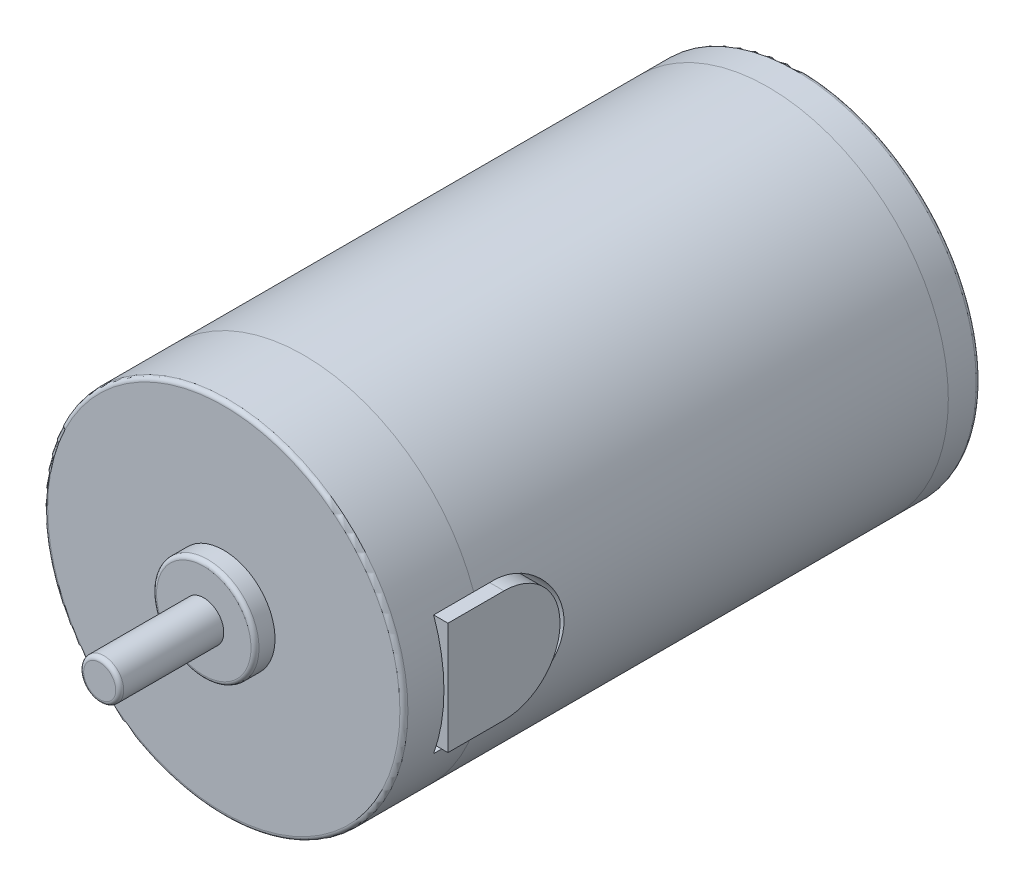
ISO-10303-21;
HEADER;
FILE_DESCRIPTION(('STEP AP214'),'2;1');
FILE_NAME('part.step','',(''),(''),'','','');
FILE_SCHEMA(('AUTOMOTIVE_DESIGN { 1 0 10303 214 1 1 1 1 }'));
ENDSEC;
DATA;
#1=APPLICATION_CONTEXT('core data for automotive mechanical design processes');
#2=APPLICATION_PROTOCOL_DEFINITION('international standard','automotive_design',2000,#1);
#3=PRODUCT_CONTEXT('',#1,'mechanical');
#4=PRODUCT('Part','Part','',(#3));
#5=PRODUCT_RELATED_PRODUCT_CATEGORY('part','',(#4));
#6=PRODUCT_DEFINITION_FORMATION('','',#4);
#7=PRODUCT_DEFINITION_CONTEXT('part definition',#1,'design');
#8=PRODUCT_DEFINITION('design','',#6,#7);
#9=PRODUCT_DEFINITION_SHAPE('','',#8);
#10=(LENGTH_UNIT() NAMED_UNIT(*) SI_UNIT(.MILLI.,.METRE.));
#11=(NAMED_UNIT(*) PLANE_ANGLE_UNIT() SI_UNIT($,.RADIAN.));
#12=(NAMED_UNIT(*) SI_UNIT($,.STERADIAN.) SOLID_ANGLE_UNIT());
#13=UNCERTAINTY_MEASURE_WITH_UNIT(LENGTH_MEASURE(1.E-05),#10,'distance_accuracy_value','');
#14=(GEOMETRIC_REPRESENTATION_CONTEXT(3) GLOBAL_UNCERTAINTY_ASSIGNED_CONTEXT((#13)) GLOBAL_UNIT_ASSIGNED_CONTEXT((#10,
#11,#12)) REPRESENTATION_CONTEXT('',''));
#15=CARTESIAN_POINT('',(0.,0.,0.));
#16=DIRECTION('',(0.,0.,1.));
#17=DIRECTION('',(1.,0.,0.));
#18=AXIS2_PLACEMENT_3D('',#15,#16,#17);
#19=CARTESIAN_POINT('',(0.,0.,0.));
#20=DIRECTION('',(0.,0.,-1.));
#21=DIRECTION('',(-1.,0.,0.));
#22=AXIS2_PLACEMENT_3D('',#19,#20,#21);
#23=CYLINDRICAL_SURFACE('',#22,22.5);
#24=CARTESIAN_POINT('',(0.,0.,4.));
#25=DIRECTION('',(0.,0.,-1.));
#26=DIRECTION('',(0.,1.,0.));
#27=AXIS2_PLACEMENT_3D('',#24,#25,#26);
#28=CIRCLE('',#27,22.5);
#29=CARTESIAN_POINT('',(0.,-22.5,4.));
#30=VERTEX_POINT('',#29);
#31=CARTESIAN_POINT('',(0.,22.5,4.));
#32=VERTEX_POINT('',#31);
#33=EDGE_CURVE('E321',#30,#32,#28,.F.);
#34=ORIENTED_EDGE('',*,*,#33,.T.);
#35=EDGE_CURVE('E325',#32,#30,#28,.F.);
#36=ORIENTED_EDGE('',*,*,#35,.T.);
#37=EDGE_LOOP('',(#34,#36));
#38=FACE_BOUND('',#37,.T.);
#39=CARTESIAN_POINT('',(0.,0.,62.));
#40=DIRECTION('',(0.,0.,-1.));
#41=DIRECTION('',(0.,1.,0.));
#42=AXIS2_PLACEMENT_3D('',#39,#40,#41);
#43=CIRCLE('',#42,22.5);
#44=CARTESIAN_POINT('',(-21.2132034355964,-7.49999999999998,62.));
#45=VERTEX_POINT('',#44);
#46=CARTESIAN_POINT('',(0.,-22.5,62.));
#47=VERTEX_POINT('',#46);
#48=EDGE_CURVE('E319',#45,#47,#43,.F.);
#49=ORIENTED_EDGE('',*,*,#48,.F.);
#50=DIRECTION('',(0.,0.,-1.));
#51=VECTOR('',#50,1.);
#52=CARTESIAN_POINT('',(-21.2132034355964,-7.49999999999998,0.));
#53=LINE('',#52,#51);
#54=CARTESIAN_POINT('',(-21.2132034355964,-7.49999999999999,59.5));
#55=VERTEX_POINT('',#54);
#56=EDGE_CURVE('E237',#45,#55,#53,.T.);
#57=ORIENTED_EDGE('',*,*,#56,.T.);
#58=CARTESIAN_POINT('',(-21.2132034355964,-7.5,59.5));
#59=CARTESIAN_POINT('',(-21.2131698601994,-7.50002909434924,59.29538248346));
#60=CARTESIAN_POINT('',(-21.2161628473145,-7.49162767701928,59.0907776341581));
#61=CARTESIAN_POINT('',(-21.2279561906622,-7.4581803133176,58.6831550271935));
#62=CARTESIAN_POINT('',(-21.2367549792327,-7.43313886001647,58.4801368560705));
#63=CARTESIAN_POINT('',(-21.2598802246242,-7.36672589632513,58.0777322389389));
#64=CARTESIAN_POINT('',(-21.2741902834876,-7.32540282113041,57.8783368396676));
#65=CARTESIAN_POINT('',(-21.3078818593139,-7.22681804240021,57.4839622464634));
#66=CARTESIAN_POINT('',(-21.3272635595626,-7.16955576282734,57.2889832124118));
#67=CARTESIAN_POINT('',(-21.3704954114402,-7.03964473805045,56.904914297494));
#68=CARTESIAN_POINT('',(-21.394341953067,-6.96700841722466,56.7158198017907));
#69=CARTESIAN_POINT('',(-21.4458257189055,-6.8068811511058,56.3444860843478));
#70=CARTESIAN_POINT('',(-21.4734643521334,-6.71938468138361,56.1622494429843));
#71=CARTESIAN_POINT('',(-21.5317541800848,-6.53018810396585,55.8057649904732));
#72=CARTESIAN_POINT('',(-21.5624059975797,-6.42848505818823,55.6315188417774));
#73=CARTESIAN_POINT('',(-21.625897359703,-6.21154868862573,55.2920000626968));
#74=CARTESIAN_POINT('',(-21.6587376890376,-6.09631050030497,55.1267306899701));
#75=CARTESIAN_POINT('',(-21.7269132825655,-5.84878510718893,54.8005221603799));
#76=CARTESIAN_POINT('',(-21.7622956681428,-5.71604103814825,54.6399393523954));
#77=CARTESIAN_POINT('',(-21.8335037312281,-5.43771504368631,54.3304183176399));
#78=CARTESIAN_POINT('',(-21.8693294173298,-5.2921328690541,54.1814803170215));
#79=CARTESIAN_POINT('',(-21.9404749011191,-4.98896851579837,53.8961136145323));
#80=CARTESIAN_POINT('',(-21.975794516795,-4.83138214241325,53.7596893225126));
#81=CARTESIAN_POINT('',(-22.0449629867248,-4.50526119571736,53.5003323477956));
#82=CARTESIAN_POINT('',(-22.0788123492642,-4.33673045710713,53.3773949797037));
#83=CARTESIAN_POINT('',(-22.1450219906145,-3.98507810927253,53.1427198975304));
#84=CARTESIAN_POINT('',(-22.1773188594365,-3.80168788560119,53.0313662703396));
#85=CARTESIAN_POINT('',(-22.2385041201037,-3.4256677207239,52.8246110977922));
#86=CARTESIAN_POINT('',(-22.2673937702417,-3.23304122769018,52.7292036580115));
#87=CARTESIAN_POINT('',(-22.3209497800935,-2.8398180259788,52.5550980189717));
#88=CARTESIAN_POINT('',(-22.345616343282,-2.63922170187355,52.4763990146312));
#89=CARTESIAN_POINT('',(-22.3900068806189,-2.23150871257408,52.3364241967951));
#90=CARTESIAN_POINT('',(-22.4097310667763,-2.02439232749468,52.275147635928));
#91=CARTESIAN_POINT('',(-22.4430614974481,-1.61250916225514,52.1724297537449));
#92=CARTESIAN_POINT('',(-22.4568566273779,-1.40791110618133,52.1303728081682));
#93=CARTESIAN_POINT('',(-22.4789084924431,-0.995630675690124,52.0634464924363));
#94=CARTESIAN_POINT('',(-22.4871654486779,-0.787948424740835,52.0385764361311));
#95=CARTESIAN_POINT('',(-22.4979048793719,-0.371123439773067,52.006272196708));
#96=CARTESIAN_POINT('',(-22.5003884669374,-0.161980995080541,51.9988346525968));
#97=CARTESIAN_POINT('',(-22.4995129405441,0.25617928126824,52.0014611275526));
#98=CARTESIAN_POINT('',(-22.4961539618238,0.465197115696834,52.0115247415187));
#99=CARTESIAN_POINT('',(-22.4839369452838,0.873267929481121,52.048308628608));
#100=CARTESIAN_POINT('',(-22.4753011245303,1.07238866895073,52.0743559782884));
#101=CARTESIAN_POINT('',(-22.4529527569557,1.46769069299626,52.1422750944698));
#102=CARTESIAN_POINT('',(-22.4392385246955,1.6638709791693,52.1841521146673));
#103=CARTESIAN_POINT('',(-22.4070952461079,2.05181836927761,52.2833445679225));
#104=CARTESIAN_POINT('',(-22.3886677783507,2.24358692740878,52.3406548323728));
#105=CARTESIAN_POINT('',(-22.3475590775842,2.62159618356247,52.4702650951266));
#106=CARTESIAN_POINT('',(-22.3248762396294,2.80783476511464,52.5425707501452));
#107=CARTESIAN_POINT('',(-22.2755174963821,3.17588349487949,52.7026074666674));
#108=CARTESIAN_POINT('',(-22.2487943058965,3.35760674122855,52.7905236904));
#109=CARTESIAN_POINT('',(-22.1922404744283,3.71306703589137,52.9805091411496));
#110=CARTESIAN_POINT('',(-22.1624087708866,3.88680132395984,53.0825832116082));
#111=CARTESIAN_POINT('',(-22.1003884743408,4.2252132263548,53.300157976111));
#112=CARTESIAN_POINT('',(-22.0681997635114,4.38989038720014,53.4156593415464));
#113=CARTESIAN_POINT('',(-22.0022623174511,4.70925088946099,53.6593405315096));
#114=CARTESIAN_POINT('',(-21.9685135255208,4.86393386715911,53.7875208170311));
#115=CARTESIAN_POINT('',(-21.8986777674863,5.16948929944189,54.0621200369785));
#116=CARTESIAN_POINT('',(-21.8625556340792,5.31983712317657,54.2091143255371));
#117=CARTESIAN_POINT('',(-21.7905108194672,5.60764150651647,54.5151759276488));
#118=CARTESIAN_POINT('',(-21.7545880793291,5.74510208950156,54.6742394449559));
#119=CARTESIAN_POINT('',(-21.6839003385951,6.00639670772375,55.0036215281012));
#120=CARTESIAN_POINT('',(-21.6491361601132,6.13022120458748,55.1739478405849));
#121=CARTESIAN_POINT('',(-21.5817947177549,6.36324170341309,55.52464356969));
#122=CARTESIAN_POINT('',(-21.5492166036067,6.47244340957115,55.7050090310474));
#123=CARTESIAN_POINT('',(-21.4867173229691,6.6770202259949,56.0775387637503));
#124=CARTESIAN_POINT('',(-21.4568442463993,6.77215910785624,56.2698410121142));
#125=CARTESIAN_POINT('',(-21.4012780111611,6.94576189207952,56.6623221864171));
#126=CARTESIAN_POINT('',(-21.3755831137459,7.02423273502181,56.8624977925709));
#127=CARTESIAN_POINT('',(-21.3292271317958,7.16376155149272,57.2691535973905));
#128=CARTESIAN_POINT('',(-21.3085605743674,7.22483846919712,57.4756266637858));
#129=CARTESIAN_POINT('',(-21.2729338580985,7.32907275497639,57.8934412124492));
#130=CARTESIAN_POINT('',(-21.2579710938087,7.37223830562734,58.1047804250033));
#131=CARTESIAN_POINT('',(-21.2352550417274,7.4374116223722,58.5130793544809));
#132=CARTESIAN_POINT('',(-21.2270072647544,7.4608756924865,58.7097802328843));
#133=CARTESIAN_POINT('',(-21.2159705894885,7.49217187160105,59.1043157399874));
#134=CARTESIAN_POINT('',(-21.2131746472626,7.50002415175723,59.3021485740774));
#135=CARTESIAN_POINT('',(-21.2132034355964,7.49999999999998,59.5));
#136=B_SPLINE_CURVE_WITH_KNOTS('',3,(#58,#59,#60,#61,#62,#63,#64,#65,#66,#67,#68,#69,#70,#71,
#72,#73,#74,#75,#76,#77,#78,#79,#80,#81,#82,#83,#84,#85,#86,#87,#88,#89,#90,#91,#92,#93,#94,#95,
#96,#97,#98,#99,#100,#101,#102,#103,#104,#105,#106,#107,#108,#109,#110,#111,#112,#113,#114,#115,
#116,#117,#118,#119,#120,#121,#122,#123,#124,#125,#126,#127,#128,#129,#130,#131,#132,#133,#134,
#135),.UNSPECIFIED.,.F.,.F.,(4,2,2,2,2,2,2,2,2,2,2,2,2,2,2,2,2,2,2,2,2,2,2,2,2,2,2,2,2,2,2,2,2,
2,2,2,2,2,4),(0.,0.613638635534736,1.22711164630862,1.83877328832488,2.45045703845383,
3.06164833708557,3.67306735238838,4.28461300384992,4.89637912151772,5.52964681441623,
6.16292680289795,6.79642910970495,7.42971063444706,8.07980854205101,8.72966561037011,
9.37949135879165,10.0292892274014,10.6564922281588,11.2836701877234,11.9107272172464,
12.5377697324087,13.140069807341,13.7425699549161,14.3448685750436,14.9473948150588,
15.5576140230805,16.1680425061825,16.7785015250461,17.3889827477895,18.0282841622701,
18.6673853183619,19.3069307203285,19.9462259110633,20.5952694813644,21.2440422574535,
21.8921057121206,22.5398727805735,23.1339873690169,23.7273338337398),.UNSPECIFIED.);
#137=CARTESIAN_POINT('',(-21.2132034355964,7.49999999999998,59.5));
#138=VERTEX_POINT('',#137);
#139=EDGE_CURVE('E11',#55,#138,#136,.T.);
#140=ORIENTED_EDGE('',*,*,#139,.T.);
#141=DIRECTION('',(0.,0.,-1.));
#142=VECTOR('',#141,1.);
#143=CARTESIAN_POINT('',(-21.2132034355964,7.49999999999998,0.));
#144=LINE('',#143,#142);
#145=CARTESIAN_POINT('',(-21.2132034355964,7.49999999999998,62.));
#146=VERTEX_POINT('',#145);
#147=EDGE_CURVE('E248',#138,#146,#144,.F.);
#148=ORIENTED_EDGE('',*,*,#147,.T.);
#149=CARTESIAN_POINT('',(0.,22.5,62.));
#150=VERTEX_POINT('',#149);
#151=EDGE_CURVE('E320',#150,#146,#43,.F.);
#152=ORIENTED_EDGE('',*,*,#151,.F.);
#153=CARTESIAN_POINT('',(21.2132034355964,7.49999999999998,62.));
#154=VERTEX_POINT('',#153);
#155=EDGE_CURVE('E314',#154,#150,#43,.F.);
#156=ORIENTED_EDGE('',*,*,#155,.F.);
#157=DIRECTION('',(0.,0.,-1.));
#158=VECTOR('',#157,1.);
#159=CARTESIAN_POINT('',(21.2132034355964,7.49999999999998,0.));
#160=LINE('',#159,#158);
#161=CARTESIAN_POINT('',(21.2132034355964,7.49999999999998,59.5));
#162=VERTEX_POINT('',#161);
#163=EDGE_CURVE('E306',#162,#154,#160,.F.);
#164=ORIENTED_EDGE('',*,*,#163,.F.);
#165=CARTESIAN_POINT('',(21.2132034355964,-7.5,59.5));
#166=CARTESIAN_POINT('',(21.2131698601994,-7.50002909434924,59.29538248346));
#167=CARTESIAN_POINT('',(21.2161628473145,-7.49162767701928,59.0907776341581));
#168=CARTESIAN_POINT('',(21.2279561906622,-7.4581803133176,58.6831550271935));
#169=CARTESIAN_POINT('',(21.2367549792327,-7.43313886001647,58.4801368560705));
#170=CARTESIAN_POINT('',(21.2598802246242,-7.36672589632513,58.0777322389389));
#171=CARTESIAN_POINT('',(21.2741902834876,-7.32540282113041,57.8783368396676));
#172=CARTESIAN_POINT('',(21.3078818593139,-7.22681804240021,57.4839622464634));
#173=CARTESIAN_POINT('',(21.3272635595626,-7.16955576282734,57.2889832124118));
#174=CARTESIAN_POINT('',(21.3704954114402,-7.03964473805045,56.904914297494));
#175=CARTESIAN_POINT('',(21.394341953067,-6.96700841722466,56.7158198017907));
#176=CARTESIAN_POINT('',(21.4458257189055,-6.8068811511058,56.3444860843478));
#177=CARTESIAN_POINT('',(21.4734643521334,-6.71938468138361,56.1622494429843));
#178=CARTESIAN_POINT('',(21.5317541800848,-6.53018810396585,55.8057649904732));
#179=CARTESIAN_POINT('',(21.5624059975797,-6.42848505818823,55.6315188417774));
#180=CARTESIAN_POINT('',(21.625897359703,-6.21154868862573,55.2920000626968));
#181=CARTESIAN_POINT('',(21.6587376890376,-6.09631050030497,55.1267306899701));
#182=CARTESIAN_POINT('',(21.7269132825655,-5.84878510718893,54.8005221603799));
#183=CARTESIAN_POINT('',(21.7622956681428,-5.71604103814825,54.6399393523954));
#184=CARTESIAN_POINT('',(21.8335037312281,-5.43771504368631,54.3304183176399));
#185=CARTESIAN_POINT('',(21.8693294173298,-5.2921328690541,54.1814803170215));
#186=CARTESIAN_POINT('',(21.9404749011191,-4.98896851579837,53.8961136145323));
#187=CARTESIAN_POINT('',(21.975794516795,-4.83138214241325,53.7596893225126));
#188=CARTESIAN_POINT('',(22.0449629867248,-4.50526119571736,53.5003323477956));
#189=CARTESIAN_POINT('',(22.0788123492642,-4.33673045710713,53.3773949797037));
#190=CARTESIAN_POINT('',(22.1450219906145,-3.98507810927253,53.1427198975304));
#191=CARTESIAN_POINT('',(22.1773188594365,-3.80168788560119,53.0313662703396));
#192=CARTESIAN_POINT('',(22.2385041201037,-3.4256677207239,52.8246110977922));
#193=CARTESIAN_POINT('',(22.2673937702417,-3.23304122769018,52.7292036580115));
#194=CARTESIAN_POINT('',(22.3209497800935,-2.8398180259788,52.5550980189717));
#195=CARTESIAN_POINT('',(22.345616343282,-2.63922170187355,52.4763990146312));
#196=CARTESIAN_POINT('',(22.3900068806189,-2.23150871257408,52.3364241967951));
#197=CARTESIAN_POINT('',(22.4097310667763,-2.02439232749468,52.275147635928));
#198=CARTESIAN_POINT('',(22.4430614974481,-1.61250916225514,52.1724297537449));
#199=CARTESIAN_POINT('',(22.4568566273779,-1.40791110618133,52.1303728081682));
#200=CARTESIAN_POINT('',(22.4789084924431,-0.995630675690124,52.0634464924363));
#201=CARTESIAN_POINT('',(22.4871654486779,-0.787948424740835,52.0385764361311));
#202=CARTESIAN_POINT('',(22.4979048793719,-0.371123439773067,52.006272196708));
#203=CARTESIAN_POINT('',(22.5003884669374,-0.161980995080541,51.9988346525968));
#204=CARTESIAN_POINT('',(22.4995129405441,0.25617928126824,52.0014611275526));
#205=CARTESIAN_POINT('',(22.4961539618238,0.465197115696834,52.0115247415187));
#206=CARTESIAN_POINT('',(22.4839369452838,0.873267929481121,52.048308628608));
#207=CARTESIAN_POINT('',(22.4753011245303,1.07238866895073,52.0743559782884));
#208=CARTESIAN_POINT('',(22.4529527569557,1.46769069299626,52.1422750944698));
#209=CARTESIAN_POINT('',(22.4392385246955,1.6638709791693,52.1841521146673));
#210=CARTESIAN_POINT('',(22.4070952461079,2.05181836927761,52.2833445679225));
#211=CARTESIAN_POINT('',(22.3886677783507,2.24358692740878,52.3406548323728));
#212=CARTESIAN_POINT('',(22.3475590775842,2.62159618356247,52.4702650951266));
#213=CARTESIAN_POINT('',(22.3248762396294,2.80783476511464,52.5425707501452));
#214=CARTESIAN_POINT('',(22.2755174963821,3.17588349487949,52.7026074666674));
#215=CARTESIAN_POINT('',(22.2487943058965,3.35760674122855,52.7905236904));
#216=CARTESIAN_POINT('',(22.1922404744283,3.71306703589137,52.9805091411496));
#217=CARTESIAN_POINT('',(22.1624087708866,3.88680132395984,53.0825832116082));
#218=CARTESIAN_POINT('',(22.1003884743408,4.2252132263548,53.300157976111));
#219=CARTESIAN_POINT('',(22.0681997635114,4.38989038720014,53.4156593415464));
#220=CARTESIAN_POINT('',(22.0022623174511,4.70925088946099,53.6593405315096));
#221=CARTESIAN_POINT('',(21.9685135255208,4.86393386715911,53.7875208170311));
#222=CARTESIAN_POINT('',(21.8986777674863,5.16948929944189,54.0621200369785));
#223=CARTESIAN_POINT('',(21.8625556340792,5.31983712317657,54.2091143255371));
#224=CARTESIAN_POINT('',(21.7905108194672,5.60764150651647,54.5151759276488));
#225=CARTESIAN_POINT('',(21.7545880793291,5.74510208950156,54.6742394449559));
#226=CARTESIAN_POINT('',(21.6839003385951,6.00639670772375,55.0036215281012));
#227=CARTESIAN_POINT('',(21.6491361601132,6.13022120458748,55.1739478405849));
#228=CARTESIAN_POINT('',(21.5817947177549,6.36324170341309,55.52464356969));
#229=CARTESIAN_POINT('',(21.5492166036067,6.47244340957115,55.7050090310474));
#230=CARTESIAN_POINT('',(21.4867173229691,6.6770202259949,56.0775387637503));
#231=CARTESIAN_POINT('',(21.4568442463993,6.77215910785624,56.2698410121142));
#232=CARTESIAN_POINT('',(21.4012780111611,6.94576189207952,56.6623221864171));
#233=CARTESIAN_POINT('',(21.3755831137459,7.02423273502181,56.8624977925709));
#234=CARTESIAN_POINT('',(21.3292271317958,7.16376155149272,57.2691535973905));
#235=CARTESIAN_POINT('',(21.3085605743674,7.22483846919712,57.4756266637858));
#236=CARTESIAN_POINT('',(21.2729338580985,7.32907275497639,57.8934412124492));
#237=CARTESIAN_POINT('',(21.2579710938087,7.37223830562734,58.1047804250033));
#238=CARTESIAN_POINT('',(21.2352550417274,7.4374116223722,58.5130793544809));
#239=CARTESIAN_POINT('',(21.2270072647544,7.4608756924865,58.7097802328843));
#240=CARTESIAN_POINT('',(21.2159705894885,7.49217187160105,59.1043157399874));
#241=CARTESIAN_POINT('',(21.2131746472626,7.50002415175723,59.3021485740774));
#242=CARTESIAN_POINT('',(21.2132034355964,7.49999999999998,59.5));
#243=B_SPLINE_CURVE_WITH_KNOTS('',3,(#165,#166,#167,#168,#169,#170,#171,#172,#173,#174,#175,
#176,#177,#178,#179,#180,#181,#182,#183,#184,#185,#186,#187,#188,#189,#190,#191,#192,#193,#194,
#195,#196,#197,#198,#199,#200,#201,#202,#203,#204,#205,#206,#207,#208,#209,#210,#211,#212,#213,
#214,#215,#216,#217,#218,#219,#220,#221,#222,#223,#224,#225,#226,#227,#228,#229,#230,#231,#232,
#233,#234,#235,#236,#237,#238,#239,#240,#241,#242),.UNSPECIFIED.,.F.,.F.,(4,2,2,2,2,2,2,2,2,2,2,
2,2,2,2,2,2,2,2,2,2,2,2,2,2,2,2,2,2,2,2,2,2,2,2,2,2,2,4),(0.,0.613638635534736,1.22711164630862,
1.83877328832488,2.45045703845383,3.06164833708557,3.67306735238838,4.28461300384992,
4.89637912151772,5.52964681441623,6.16292680289795,6.79642910970495,7.42971063444706,
8.07980854205101,8.72966561037011,9.37949135879165,10.0292892274014,10.6564922281588,
11.2836701877234,11.9107272172464,12.5377697324087,13.140069807341,13.7425699549161,
14.3448685750436,14.9473948150588,15.5576140230805,16.1680425061825,16.7785015250461,
17.3889827477895,18.0282841622701,18.6673853183619,19.3069307203285,19.9462259110633,
20.5952694813644,21.2440422574535,21.8921057121206,22.5398727805735,23.1339873690169,
23.7273338337398),.UNSPECIFIED.);
#244=CARTESIAN_POINT('',(21.2132034355964,-7.49999999999999,59.5));
#245=VERTEX_POINT('',#244);
#246=EDGE_CURVE('E357',#245,#162,#243,.T.);
#247=ORIENTED_EDGE('',*,*,#246,.F.);
#248=DIRECTION('',(0.,0.,-1.));
#249=VECTOR('',#248,1.);
#250=CARTESIAN_POINT('',(21.2132034355964,-7.49999999999998,0.));
#251=LINE('',#250,#249);
#252=CARTESIAN_POINT('',(21.2132034355964,-7.49999999999998,62.));
#253=VERTEX_POINT('',#252);
#254=EDGE_CURVE('E296',#253,#245,#251,.T.);
#255=ORIENTED_EDGE('',*,*,#254,.F.);
#256=EDGE_CURVE('E315',#47,#253,#43,.F.);
#257=ORIENTED_EDGE('',*,*,#256,.F.);
#258=EDGE_LOOP('',(#49,#57,#140,#148,#152,#156,#164,#247,#255,#257));
#259=FACE_BOUND('',#258,.T.);
#260=ADVANCED_FACE('F45',(#38,#259),#23,.T.);
#261=CARTESIAN_POINT('',(0.,0.,71.5));
#262=DIRECTION('',(0.,0.,1.));
#263=DIRECTION('',(1.,0.,0.));
#264=AXIS2_PLACEMENT_3D('',#261,#262,#263);
#265=CIRCLE('',#264,22.5);
#266=CARTESIAN_POINT('',(22.5,0.,71.5));
#267=VERTEX_POINT('',#266);
#268=EDGE_CURVE('E338',#267,#267,#265,.F.);
#269=ORIENTED_EDGE('',*,*,#268,.T.);
#270=EDGE_LOOP('',(#269));
#271=FACE_BOUND('',#270,.T.);
#272=CARTESIAN_POINT('',(0.,0.,67.));
#273=DIRECTION('',(0.,0.,-1.));
#274=DIRECTION('',(-1.,0.,0.));
#275=AXIS2_PLACEMENT_3D('',#272,#273,#274);
#276=CIRCLE('',#275,22.5);
#277=CARTESIAN_POINT('',(-21.2132034355964,7.49999999999999,67.));
#278=VERTEX_POINT('',#277);
#279=CARTESIAN_POINT('',(-21.2132034355964,-7.49999999999999,67.));
#280=VERTEX_POINT('',#279);
#281=EDGE_CURVE('E364',#278,#280,#276,.F.);
#282=ORIENTED_EDGE('',*,*,#281,.T.);
#283=DIRECTION('',(0.,0.,-1.));
#284=VECTOR('',#283,1.);
#285=CARTESIAN_POINT('',(-21.2132034355964,-7.49999999999998,0.));
#286=LINE('',#285,#284);
#287=EDGE_CURVE('E59',#280,#45,#286,.T.);
#288=ORIENTED_EDGE('',*,*,#287,.T.);
#289=ORIENTED_EDGE('',*,*,#48,.T.);
#290=ORIENTED_EDGE('',*,*,#256,.T.);
#291=DIRECTION('',(0.,0.,-1.));
#292=VECTOR('',#291,1.);
#293=CARTESIAN_POINT('',(21.2132034355964,-7.49999999999998,0.));
#294=LINE('',#293,#292);
#295=CARTESIAN_POINT('',(21.2132034355964,-7.49999999999999,67.));
#296=VERTEX_POINT('',#295);
#297=EDGE_CURVE('E355',#296,#253,#294,.T.);
#298=ORIENTED_EDGE('',*,*,#297,.F.);
#299=CARTESIAN_POINT('',(0.,0.,67.));
#300=DIRECTION('',(0.,0.,1.));
#301=DIRECTION('',(1.,0.,0.));
#302=AXIS2_PLACEMENT_3D('',#299,#300,#301);
#303=CIRCLE('',#302,22.5);
#304=CARTESIAN_POINT('',(21.2132034355964,7.49999999999999,67.));
#305=VERTEX_POINT('',#304);
#306=EDGE_CURVE('E350',#305,#296,#303,.F.);
#307=ORIENTED_EDGE('',*,*,#306,.F.);
#308=DIRECTION('',(0.,0.,-1.));
#309=VECTOR('',#308,1.);
#310=CARTESIAN_POINT('',(21.2132034355964,7.49999999999998,0.));
#311=LINE('',#310,#309);
#312=EDGE_CURVE('E352',#154,#305,#311,.F.);
#313=ORIENTED_EDGE('',*,*,#312,.F.);
#314=ORIENTED_EDGE('',*,*,#155,.T.);
#315=ORIENTED_EDGE('',*,*,#151,.T.);
#316=DIRECTION('',(0.,0.,-1.));
#317=VECTOR('',#316,1.);
#318=CARTESIAN_POINT('',(-21.2132034355964,7.49999999999998,0.));
#319=LINE('',#318,#317);
#320=EDGE_CURVE('E450',#146,#278,#319,.F.);
#321=ORIENTED_EDGE('',*,*,#320,.T.);
#322=EDGE_LOOP('',(#282,#288,#289,#290,#298,#307,#313,#314,#315,#321));
#323=FACE_BOUND('',#322,.T.);
#324=ADVANCED_FACE('F416',(#271,#323),#23,.T.);
#325=CARTESIAN_POINT('',(17.5,0.,59.5));
#326=DIRECTION('',(1.,0.,0.));
#327=DIRECTION('',(0.,0.,-1.));
#328=AXIS2_PLACEMENT_3D('',#325,#326,#327);
#329=PLANE('',#328);
#330=DIRECTION('',(0.,0.,1.));
#331=VECTOR('',#330,1.);
#332=CARTESIAN_POINT('',(17.5,7.49999999999999,67.));
#333=LINE('',#332,#331);
#334=CARTESIAN_POINT('',(17.5,7.49999999999998,59.5));
#335=VERTEX_POINT('',#334);
#336=CARTESIAN_POINT('',(17.5,7.49999999999999,67.));
#337=VERTEX_POINT('',#336);
#338=EDGE_CURVE('E280',#335,#337,#333,.T.);
#339=ORIENTED_EDGE('',*,*,#338,.T.);
#340=DIRECTION('',(0.,-1.,0.));
#341=VECTOR('',#340,1.);
#342=CARTESIAN_POINT('',(17.5,-7.49999999999999,67.));
#343=LINE('',#342,#341);
#344=CARTESIAN_POINT('',(17.5,-7.49999999999999,67.));
#345=VERTEX_POINT('',#344);
#346=EDGE_CURVE('E283',#337,#345,#343,.T.);
#347=ORIENTED_EDGE('',*,*,#346,.T.);
#348=DIRECTION('',(0.,0.,-1.));
#349=VECTOR('',#348,1.);
#350=CARTESIAN_POINT('',(17.5,-7.49999999999999,67.));
#351=LINE('',#350,#349);
#352=CARTESIAN_POINT('',(17.5,-7.49999999999999,59.5));
#353=VERTEX_POINT('',#352);
#354=EDGE_CURVE('E286',#345,#353,#351,.T.);
#355=ORIENTED_EDGE('',*,*,#354,.T.);
#356=CARTESIAN_POINT('',(17.5,0.,59.5));
#357=DIRECTION('',(1.,0.,0.));
#358=DIRECTION('',(0.,0.,-1.));
#359=AXIS2_PLACEMENT_3D('',#356,#357,#358);
#360=CIRCLE('',#359,7.49999999999999);
#361=EDGE_CURVE('E289',#353,#335,#360,.T.);
#362=ORIENTED_EDGE('',*,*,#361,.T.);
#363=EDGE_LOOP('',(#339,#347,#355,#362));
#364=FACE_BOUND('',#363,.T.);
#365=DIRECTION('',(0.,0.,-1.));
#366=VECTOR('',#365,1.);
#367=CARTESIAN_POINT('',(17.5,-6.99999999999999,66.5));
#368=LINE('',#367,#366);
#369=CARTESIAN_POINT('',(17.5,-6.99999999999999,66.5));
#370=VERTEX_POINT('',#369);
#371=CARTESIAN_POINT('',(17.5,-6.99999999999999,59.5));
#372=VERTEX_POINT('',#371);
#373=EDGE_CURVE('E265',#370,#372,#368,.T.);
#374=ORIENTED_EDGE('',*,*,#373,.F.);
#375=DIRECTION('',(0.,-1.,0.));
#376=VECTOR('',#375,1.);
#377=CARTESIAN_POINT('',(17.5,6.99999999999999,66.5));
#378=LINE('',#377,#376);
#379=CARTESIAN_POINT('',(17.5,6.99999999999999,66.5));
#380=VERTEX_POINT('',#379);
#381=EDGE_CURVE('E251',#380,#370,#378,.T.);
#382=ORIENTED_EDGE('',*,*,#381,.F.);
#383=DIRECTION('',(0.,0.,1.));
#384=VECTOR('',#383,1.);
#385=CARTESIAN_POINT('',(17.5,6.99999999999998,59.5));
#386=LINE('',#385,#384);
#387=CARTESIAN_POINT('',(17.5,6.99999999999998,59.5));
#388=VERTEX_POINT('',#387);
#389=EDGE_CURVE('E256',#388,#380,#386,.T.);
#390=ORIENTED_EDGE('',*,*,#389,.F.);
#391=CARTESIAN_POINT('',(17.5,0.,59.5));
#392=DIRECTION('',(1.,0.,0.));
#393=DIRECTION('',(0.,0.,-1.));
#394=AXIS2_PLACEMENT_3D('',#391,#392,#393);
#395=CIRCLE('',#394,6.99999999999999);
#396=EDGE_CURVE('E267',#372,#388,#395,.T.);
#397=ORIENTED_EDGE('',*,*,#396,.F.);
#398=EDGE_LOOP('',(#374,#382,#390,#397));
#399=FACE_BOUND('',#398,.T.);
#400=ADVANCED_FACE('F378',(#364,#399),#329,.T.);
#401=CARTESIAN_POINT('',(0.,0.,0.));
#402=DIRECTION('',(0.,0.,-1.));
#403=DIRECTION('',(-1.,0.,0.));
#404=AXIS2_PLACEMENT_3D('',#401,#402,#403);
#405=PLANE('',#404);
#406=CARTESIAN_POINT('',(0.,0.,0.));
#407=DIRECTION('',(0.,0.,-1.));
#408=DIRECTION('',(-1.,0.,0.));
#409=AXIS2_PLACEMENT_3D('',#406,#407,#408);
#410=CIRCLE('',#409,22.);
#411=CARTESIAN_POINT('',(-22.,0.,0.));
#412=VERTEX_POINT('',#411);
#413=EDGE_CURVE('E332',#412,#412,#410,.T.);
#414=ORIENTED_EDGE('',*,*,#413,.T.);
#415=EDGE_LOOP('',(#414));
#416=FACE_BOUND('',#415,.T.);
#417=ADVANCED_FACE('F414',(#416),#405,.T.);
#418=CARTESIAN_POINT('',(0.,0.,0.5));
#419=DIRECTION('',(0.,0.,-1.));
#420=DIRECTION('',(-1.,0.,0.));
#421=AXIS2_PLACEMENT_3D('',#418,#419,#420);
#422=CIRCLE('',#421,22.5);
#423=CARTESIAN_POINT('',(-22.5,0.,0.5));
#424=VERTEX_POINT('',#423);
#425=EDGE_CURVE('E335',#424,#424,#422,.F.);
#426=ORIENTED_EDGE('',*,*,#425,.T.);
#427=EDGE_LOOP('',(#426));
#428=FACE_BOUND('',#427,.T.);
#429=ORIENTED_EDGE('',*,*,#35,.F.);
#430=ORIENTED_EDGE('',*,*,#33,.F.);
#431=EDGE_LOOP('',(#429,#430));
#432=FACE_BOUND('',#431,.T.);
#433=ADVANCED_FACE('F366',(#428,#432),#23,.T.);
#434=CARTESIAN_POINT('',(0.,22.5,72.));
#435=DIRECTION('',(0.,0.,1.));
#436=DIRECTION('',(1.,0.,0.));
#437=AXIS2_PLACEMENT_3D('',#434,#435,#436);
#438=PLANE('',#437);
#439=CARTESIAN_POINT('',(0.,0.,72.));
#440=DIRECTION('',(0.,0.,1.));
#441=DIRECTION('',(1.,0.,0.));
#442=AXIS2_PLACEMENT_3D('',#439,#440,#441);
#443=CIRCLE('',#442,22.);
#444=CARTESIAN_POINT('',(22.,0.,72.));
#445=VERTEX_POINT('',#444);
#446=EDGE_CURVE('E341',#445,#445,#443,.T.);
#447=ORIENTED_EDGE('',*,*,#446,.T.);
#448=EDGE_LOOP('',(#447));
#449=FACE_BOUND('',#448,.T.);
#450=CARTESIAN_POINT('',(0.,0.,72.));
#451=DIRECTION('',(0.,0.,-1.));
#452=DIRECTION('',(-1.,0.,0.));
#453=AXIS2_PLACEMENT_3D('',#450,#451,#452);
#454=CIRCLE('',#453,6.4);
#455=CARTESIAN_POINT('',(-6.4,0.,72.));
#456=VERTEX_POINT('',#455);
#457=EDGE_CURVE('E311',#456,#456,#454,.T.);
#458=ORIENTED_EDGE('',*,*,#457,.T.);
#459=EDGE_LOOP('',(#458));
#460=FACE_BOUND('',#459,.T.);
#461=ADVANCED_FACE('F406',(#449,#460),#438,.T.);
#462=CARTESIAN_POINT('',(0.,0.,0.));
#463=DIRECTION('',(0.,0.,-1.));
#464=DIRECTION('',(-1.,0.,0.));
#465=AXIS2_PLACEMENT_3D('',#462,#463,#464);
#466=CYLINDRICAL_SURFACE('',#465,6.4);
#467=CARTESIAN_POINT('',(0.,0.,74.));
#468=DIRECTION('',(0.,0.,1.));
#469=DIRECTION('',(1.,0.,0.));
#470=AXIS2_PLACEMENT_3D('',#467,#468,#469);
#471=CIRCLE('',#470,6.4);
#472=CARTESIAN_POINT('',(6.4,0.,74.));
#473=VERTEX_POINT('',#472);
#474=EDGE_CURVE('E326',#473,#473,#471,.F.);
#475=ORIENTED_EDGE('',*,*,#474,.T.);
#476=EDGE_LOOP('',(#475));
#477=FACE_BOUND('',#476,.T.);
#478=ORIENTED_EDGE('',*,*,#457,.F.);
#479=EDGE_LOOP('',(#478));
#480=FACE_BOUND('',#479,.T.);
#481=ADVANCED_FACE('F403',(#477,#480),#466,.T.);
#482=CARTESIAN_POINT('',(0.,6.4,74.5));
#483=DIRECTION('',(0.,0.,1.));
#484=DIRECTION('',(1.,0.,0.));
#485=AXIS2_PLACEMENT_3D('',#482,#483,#484);
#486=PLANE('',#485);
#487=CARTESIAN_POINT('',(0.,0.,74.5));
#488=DIRECTION('',(0.,0.,1.));
#489=DIRECTION('',(1.,0.,0.));
#490=AXIS2_PLACEMENT_3D('',#487,#488,#489);
#491=CIRCLE('',#490,5.9);
#492=CARTESIAN_POINT('',(5.9,0.,74.5));
#493=VERTEX_POINT('',#492);
#494=EDGE_CURVE('E329',#493,#493,#491,.T.);
#495=ORIENTED_EDGE('',*,*,#494,.T.);
#496=EDGE_LOOP('',(#495));
#497=FACE_BOUND('',#496,.T.);
#498=CARTESIAN_POINT('',(0.,0.,74.5));
#499=DIRECTION('',(0.,0.,-1.));
#500=DIRECTION('',(-1.,0.,0.));
#501=AXIS2_PLACEMENT_3D('',#498,#499,#500);
#502=CIRCLE('',#501,2.5);
#503=CARTESIAN_POINT('',(-2.5,0.,74.5));
#504=VERTEX_POINT('',#503);
#505=EDGE_CURVE('E308',#504,#504,#502,.T.);
#506=ORIENTED_EDGE('',*,*,#505,.T.);
#507=EDGE_LOOP('',(#506));
#508=FACE_BOUND('',#507,.T.);
#509=ADVANCED_FACE('F399',(#497,#508),#486,.T.);
#510=CARTESIAN_POINT('',(0.,0.,0.));
#511=DIRECTION('',(0.,0.,-1.));
#512=DIRECTION('',(-1.,0.,0.));
#513=AXIS2_PLACEMENT_3D('',#510,#511,#512);
#514=CYLINDRICAL_SURFACE('',#513,2.5);
#515=CARTESIAN_POINT('',(0.,0.,87.));
#516=DIRECTION('',(0.,0.,1.));
#517=DIRECTION('',(1.,0.,0.));
#518=AXIS2_PLACEMENT_3D('',#515,#516,#517);
#519=CIRCLE('',#518,2.5);
#520=CARTESIAN_POINT('',(2.5,0.,87.));
#521=VERTEX_POINT('',#520);
#522=EDGE_CURVE('E344',#521,#521,#519,.F.);
#523=ORIENTED_EDGE('',*,*,#522,.T.);
#524=EDGE_LOOP('',(#523));
#525=FACE_BOUND('',#524,.T.);
#526=ORIENTED_EDGE('',*,*,#505,.F.);
#527=EDGE_LOOP('',(#526));
#528=FACE_BOUND('',#527,.T.);
#529=ADVANCED_FACE('F395',(#525,#528),#514,.T.);
#530=CARTESIAN_POINT('',(0.,2.5,87.5));
#531=DIRECTION('',(0.,0.,1.));
#532=DIRECTION('',(1.,0.,0.));
#533=AXIS2_PLACEMENT_3D('',#530,#531,#532);
#534=PLANE('',#533);
#535=CARTESIAN_POINT('',(0.,0.,87.5));
#536=DIRECTION('',(0.,0.,1.));
#537=DIRECTION('',(1.,0.,0.));
#538=AXIS2_PLACEMENT_3D('',#535,#536,#537);
#539=CIRCLE('',#538,2.);
#540=CARTESIAN_POINT('',(2.,0.,87.5));
#541=VERTEX_POINT('',#540);
#542=EDGE_CURVE('E347',#541,#541,#539,.T.);
#543=ORIENTED_EDGE('',*,*,#542,.T.);
#544=EDGE_LOOP('',(#543));
#545=FACE_BOUND('',#544,.T.);
#546=ADVANCED_FACE('F391',(#545),#534,.T.);
#547=CARTESIAN_POINT('',(0.,0.,74.));
#548=DIRECTION('',(0.,0.,1.));
#549=DIRECTION('',(1.,0.,0.));
#550=AXIS2_PLACEMENT_3D('',#547,#548,#549);
#551=TOROIDAL_SURFACE('',#550,5.9,0.5);
#552=ORIENTED_EDGE('',*,*,#494,.F.);
#553=EDGE_LOOP('',(#552));
#554=FACE_BOUND('',#553,.T.);
#555=ORIENTED_EDGE('',*,*,#474,.F.);
#556=EDGE_LOOP('',(#555));
#557=FACE_BOUND('',#556,.T.);
#558=ADVANCED_FACE('F394',(#554,#557),#551,.T.);
#559=CARTESIAN_POINT('',(0.,0.,0.5));
#560=DIRECTION('',(0.,0.,-1.));
#561=DIRECTION('',(-1.,0.,0.));
#562=AXIS2_PLACEMENT_3D('',#559,#560,#561);
#563=TOROIDAL_SURFACE('',#562,22.,0.5);
#564=ORIENTED_EDGE('',*,*,#425,.F.);
#565=EDGE_LOOP('',(#564));
#566=FACE_BOUND('',#565,.T.);
#567=ORIENTED_EDGE('',*,*,#413,.F.);
#568=EDGE_LOOP('',(#567));
#569=FACE_BOUND('',#568,.T.);
#570=ADVANCED_FACE('F523',(#566,#569),#563,.T.);
#571=CARTESIAN_POINT('',(0.,0.,71.5));
#572=DIRECTION('',(0.,0.,1.));
#573=DIRECTION('',(1.,0.,0.));
#574=AXIS2_PLACEMENT_3D('',#571,#572,#573);
#575=TOROIDAL_SURFACE('',#574,22.,0.5);
#576=ORIENTED_EDGE('',*,*,#446,.F.);
#577=EDGE_LOOP('',(#576));
#578=FACE_BOUND('',#577,.T.);
#579=ORIENTED_EDGE('',*,*,#268,.F.);
#580=EDGE_LOOP('',(#579));
#581=FACE_BOUND('',#580,.T.);
#582=ADVANCED_FACE('F526',(#578,#581),#575,.T.);
#583=CARTESIAN_POINT('',(0.,0.,87.));
#584=DIRECTION('',(0.,0.,1.));
#585=DIRECTION('',(1.,0.,0.));
#586=AXIS2_PLACEMENT_3D('',#583,#584,#585);
#587=TOROIDAL_SURFACE('',#586,2.,0.5);
#588=ORIENTED_EDGE('',*,*,#542,.F.);
#589=EDGE_LOOP('',(#588));
#590=FACE_BOUND('',#589,.T.);
#591=ORIENTED_EDGE('',*,*,#522,.F.);
#592=EDGE_LOOP('',(#591));
#593=FACE_BOUND('',#592,.T.);
#594=ADVANCED_FACE('F47',(#590,#593),#587,.T.);
#595=CARTESIAN_POINT('',(17.5,7.49999999999999,67.));
#596=DIRECTION('',(0.,1.,0.));
#597=DIRECTION('',(0.,0.,1.));
#598=AXIS2_PLACEMENT_3D('',#595,#596,#597);
#599=PLANE('',#598);
#600=ORIENTED_EDGE('',*,*,#163,.T.);
#601=ORIENTED_EDGE('',*,*,#312,.T.);
#602=DIRECTION('',(1.,0.,0.));
#603=VECTOR('',#602,1.);
#604=CARTESIAN_POINT('',(17.5,7.49999999999999,67.));
#605=LINE('',#604,#603);
#606=EDGE_CURVE('E292',#337,#305,#605,.T.);
#607=ORIENTED_EDGE('',*,*,#606,.F.);
#608=ORIENTED_EDGE('',*,*,#338,.F.);
#609=DIRECTION('',(1.,0.,0.));
#610=VECTOR('',#609,1.);
#611=CARTESIAN_POINT('',(17.5,7.49999999999998,59.5));
#612=LINE('',#611,#610);
#613=EDGE_CURVE('E293',#335,#162,#612,.T.);
#614=ORIENTED_EDGE('',*,*,#613,.T.);
#615=EDGE_LOOP('',(#600,#601,#607,#608,#614));
#616=FACE_BOUND('',#615,.T.);
#617=ADVANCED_FACE('F376',(#616),#599,.F.);
#618=CARTESIAN_POINT('',(17.5,0.,59.5));
#619=DIRECTION('',(1.,0.,0.));
#620=DIRECTION('',(0.,0.,-1.));
#621=AXIS2_PLACEMENT_3D('',#618,#619,#620);
#622=CYLINDRICAL_SURFACE('',#621,7.49999999999999);
#623=DIRECTION('',(1.,0.,0.));
#624=VECTOR('',#623,1.);
#625=CARTESIAN_POINT('',(17.5,-7.49999999999999,59.5));
#626=LINE('',#625,#624);
#627=EDGE_CURVE('E297',#353,#245,#626,.T.);
#628=ORIENTED_EDGE('',*,*,#627,.T.);
#629=ORIENTED_EDGE('',*,*,#246,.T.);
#630=ORIENTED_EDGE('',*,*,#613,.F.);
#631=ORIENTED_EDGE('',*,*,#361,.F.);
#632=EDGE_LOOP('',(#628,#629,#630,#631));
#633=FACE_BOUND('',#632,.T.);
#634=ADVANCED_FACE('F370',(#633),#622,.F.);
#635=CARTESIAN_POINT('',(17.5,-7.49999999999999,67.));
#636=DIRECTION('',(0.,-1.,0.));
#637=DIRECTION('',(0.,0.,-1.));
#638=AXIS2_PLACEMENT_3D('',#635,#636,#637);
#639=PLANE('',#638);
#640=ORIENTED_EDGE('',*,*,#254,.T.);
#641=ORIENTED_EDGE('',*,*,#627,.F.);
#642=ORIENTED_EDGE('',*,*,#354,.F.);
#643=DIRECTION('',(1.,0.,0.));
#644=VECTOR('',#643,1.);
#645=CARTESIAN_POINT('',(17.5,-7.49999999999999,67.));
#646=LINE('',#645,#644);
#647=EDGE_CURVE('E300',#345,#296,#646,.T.);
#648=ORIENTED_EDGE('',*,*,#647,.T.);
#649=ORIENTED_EDGE('',*,*,#297,.T.);
#650=EDGE_LOOP('',(#640,#641,#642,#648,#649));
#651=FACE_BOUND('',#650,.T.);
#652=ADVANCED_FACE('F375',(#651),#639,.F.);
#653=CARTESIAN_POINT('',(17.5,-7.49999999999999,67.));
#654=DIRECTION('',(0.,0.,1.));
#655=DIRECTION('',(1.,0.,0.));
#656=AXIS2_PLACEMENT_3D('',#653,#654,#655);
#657=PLANE('',#656);
#658=ORIENTED_EDGE('',*,*,#306,.T.);
#659=ORIENTED_EDGE('',*,*,#647,.F.);
#660=ORIENTED_EDGE('',*,*,#346,.F.);
#661=ORIENTED_EDGE('',*,*,#606,.T.);
#662=EDGE_LOOP('',(#658,#659,#660,#661));
#663=FACE_BOUND('',#662,.T.);
#664=ADVANCED_FACE('F382',(#663),#657,.F.);
#665=CARTESIAN_POINT('',(22.5,6.99999999999999,66.5));
#666=DIRECTION('',(0.,0.,-1.));
#667=DIRECTION('',(-1.,0.,0.));
#668=AXIS2_PLACEMENT_3D('',#665,#666,#667);
#669=PLANE('',#668);
#670=ORIENTED_EDGE('',*,*,#381,.T.);
#671=DIRECTION('',(-1.,0.,0.));
#672=VECTOR('',#671,1.);
#673=CARTESIAN_POINT('',(22.5,-6.99999999999999,66.5));
#674=LINE('',#673,#672);
#675=CARTESIAN_POINT('',(22.5,-6.99999999999999,66.5));
#676=VERTEX_POINT('',#675);
#677=EDGE_CURVE('E278',#676,#370,#674,.T.);
#678=ORIENTED_EDGE('',*,*,#677,.F.);
#679=DIRECTION('',(0.,-1.,0.));
#680=VECTOR('',#679,1.);
#681=CARTESIAN_POINT('',(22.5,6.99999999999999,66.5));
#682=LINE('',#681,#680);
#683=CARTESIAN_POINT('',(22.5,6.99999999999999,66.5));
#684=VERTEX_POINT('',#683);
#685=EDGE_CURVE('E252',#684,#676,#682,.T.);
#686=ORIENTED_EDGE('',*,*,#685,.F.);
#687=DIRECTION('',(-1.,0.,0.));
#688=VECTOR('',#687,1.);
#689=CARTESIAN_POINT('',(22.5,6.99999999999999,66.5));
#690=LINE('',#689,#688);
#691=EDGE_CURVE('E262',#684,#380,#690,.T.);
#692=ORIENTED_EDGE('',*,*,#691,.T.);
#693=EDGE_LOOP('',(#670,#678,#686,#692));
#694=FACE_BOUND('',#693,.T.);
#695=ADVANCED_FACE('F386',(#694),#669,.F.);
#696=CARTESIAN_POINT('',(22.5,-6.99999999999999,66.5));
#697=DIRECTION('',(0.,1.,0.));
#698=DIRECTION('',(0.,0.,1.));
#699=AXIS2_PLACEMENT_3D('',#696,#697,#698);
#700=PLANE('',#699);
#701=ORIENTED_EDGE('',*,*,#373,.T.);
#702=DIRECTION('',(-1.,0.,0.));
#703=VECTOR('',#702,1.);
#704=CARTESIAN_POINT('',(22.5,-6.99999999999999,59.5));
#705=LINE('',#704,#703);
#706=CARTESIAN_POINT('',(22.5,-6.99999999999999,59.5));
#707=VERTEX_POINT('',#706);
#708=EDGE_CURVE('E275',#707,#372,#705,.T.);
#709=ORIENTED_EDGE('',*,*,#708,.F.);
#710=DIRECTION('',(0.,0.,-1.));
#711=VECTOR('',#710,1.);
#712=CARTESIAN_POINT('',(22.5,-6.99999999999999,66.5));
#713=LINE('',#712,#711);
#714=EDGE_CURVE('E255',#676,#707,#713,.T.);
#715=ORIENTED_EDGE('',*,*,#714,.F.);
#716=ORIENTED_EDGE('',*,*,#677,.T.);
#717=EDGE_LOOP('',(#701,#709,#715,#716));
#718=FACE_BOUND('',#717,.T.);
#719=ADVANCED_FACE('F488',(#718),#700,.F.);
#720=CARTESIAN_POINT('',(22.5,0.,59.5));
#721=DIRECTION('',(-1.,0.,0.));
#722=DIRECTION('',(0.,0.,1.));
#723=AXIS2_PLACEMENT_3D('',#720,#721,#722);
#724=CYLINDRICAL_SURFACE('',#723,6.99999999999999);
#725=ORIENTED_EDGE('',*,*,#396,.T.);
#726=DIRECTION('',(-1.,0.,0.));
#727=VECTOR('',#726,1.);
#728=CARTESIAN_POINT('',(22.5,6.99999999999998,59.5));
#729=LINE('',#728,#727);
#730=CARTESIAN_POINT('',(22.5,6.99999999999998,59.5));
#731=VERTEX_POINT('',#730);
#732=EDGE_CURVE('E273',#731,#388,#729,.T.);
#733=ORIENTED_EDGE('',*,*,#732,.F.);
#734=CARTESIAN_POINT('',(22.5,0.,59.5));
#735=DIRECTION('',(1.,0.,0.));
#736=DIRECTION('',(0.,0.,-1.));
#737=AXIS2_PLACEMENT_3D('',#734,#735,#736);
#738=CIRCLE('',#737,6.99999999999999);
#739=EDGE_CURVE('E258',#707,#731,#738,.T.);
#740=ORIENTED_EDGE('',*,*,#739,.F.);
#741=ORIENTED_EDGE('',*,*,#708,.T.);
#742=EDGE_LOOP('',(#725,#733,#740,#741));
#743=FACE_BOUND('',#742,.T.);
#744=ADVANCED_FACE('F484',(#743),#724,.T.);
#745=CARTESIAN_POINT('',(22.5,6.99999999999998,59.5));
#746=DIRECTION('',(0.,-1.,0.));
#747=DIRECTION('',(0.,0.,-1.));
#748=AXIS2_PLACEMENT_3D('',#745,#746,#747);
#749=PLANE('',#748);
#750=ORIENTED_EDGE('',*,*,#389,.T.);
#751=ORIENTED_EDGE('',*,*,#691,.F.);
#752=DIRECTION('',(0.,0.,1.));
#753=VECTOR('',#752,1.);
#754=CARTESIAN_POINT('',(22.5,6.99999999999998,59.5));
#755=LINE('',#754,#753);
#756=EDGE_CURVE('E260',#731,#684,#755,.T.);
#757=ORIENTED_EDGE('',*,*,#756,.F.);
#758=ORIENTED_EDGE('',*,*,#732,.T.);
#759=EDGE_LOOP('',(#750,#751,#757,#758));
#760=FACE_BOUND('',#759,.T.);
#761=ADVANCED_FACE('F480',(#760),#749,.F.);
#762=CARTESIAN_POINT('',(22.5,0.,59.5));
#763=DIRECTION('',(1.,0.,0.));
#764=DIRECTION('',(0.,0.,-1.));
#765=AXIS2_PLACEMENT_3D('',#762,#763,#764);
#766=PLANE('',#765);
#767=ORIENTED_EDGE('',*,*,#685,.T.);
#768=ORIENTED_EDGE('',*,*,#714,.T.);
#769=ORIENTED_EDGE('',*,*,#739,.T.);
#770=ORIENTED_EDGE('',*,*,#756,.T.);
#771=EDGE_LOOP('',(#767,#768,#769,#770));
#772=FACE_BOUND('',#771,.T.);
#773=ADVANCED_FACE('F477',(#772),#766,.T.);
#774=CARTESIAN_POINT('',(-17.5,7.49999999999999,67.));
#775=DIRECTION('',(0.,-1.,0.));
#776=DIRECTION('',(0.,0.,-1.));
#777=AXIS2_PLACEMENT_3D('',#774,#775,#776);
#778=PLANE('',#777);
#779=DIRECTION('',(-1.,0.,0.));
#780=VECTOR('',#779,1.);
#781=CARTESIAN_POINT('',(-17.5,7.49999999999998,59.5));
#782=LINE('',#781,#780);
#783=CARTESIAN_POINT('',(-17.5,7.49999999999998,59.5));
#784=VERTEX_POINT('',#783);
#785=EDGE_CURVE('E233',#784,#138,#782,.T.);
#786=ORIENTED_EDGE('',*,*,#785,.F.);
#787=DIRECTION('',(0.,0.,1.));
#788=VECTOR('',#787,1.);
#789=CARTESIAN_POINT('',(-17.5,7.49999999999999,67.));
#790=LINE('',#789,#788);
#791=CARTESIAN_POINT('',(-17.5,7.49999999999999,67.));
#792=VERTEX_POINT('',#791);
#793=EDGE_CURVE('E196',#784,#792,#790,.T.);
#794=ORIENTED_EDGE('',*,*,#793,.T.);
#795=DIRECTION('',(-1.,0.,0.));
#796=VECTOR('',#795,1.);
#797=CARTESIAN_POINT('',(-17.5,7.49999999999999,67.));
#798=LINE('',#797,#796);
#799=EDGE_CURVE('E234',#792,#278,#798,.T.);
#800=ORIENTED_EDGE('',*,*,#799,.T.);
#801=ORIENTED_EDGE('',*,*,#320,.F.);
#802=ORIENTED_EDGE('',*,*,#147,.F.);
#803=EDGE_LOOP('',(#786,#794,#800,#801,#802));
#804=FACE_BOUND('',#803,.T.);
#805=ADVANCED_FACE('F448',(#804),#778,.T.);
#806=CARTESIAN_POINT('',(-17.5,-7.49999999999999,67.));
#807=DIRECTION('',(0.,0.,-1.));
#808=DIRECTION('',(-1.,0.,0.));
#809=AXIS2_PLACEMENT_3D('',#806,#807,#808);
#810=PLANE('',#809);
#811=ORIENTED_EDGE('',*,*,#281,.F.);
#812=ORIENTED_EDGE('',*,*,#799,.F.);
#813=DIRECTION('',(0.,-1.,0.));
#814=VECTOR('',#813,1.);
#815=CARTESIAN_POINT('',(-17.5,-7.49999999999999,67.));
#816=LINE('',#815,#814);
#817=CARTESIAN_POINT('',(-17.5,-7.49999999999999,67.));
#818=VERTEX_POINT('',#817);
#819=EDGE_CURVE('E231',#792,#818,#816,.T.);
#820=ORIENTED_EDGE('',*,*,#819,.T.);
#821=DIRECTION('',(-1.,0.,0.));
#822=VECTOR('',#821,1.);
#823=CARTESIAN_POINT('',(-17.5,-7.49999999999999,67.));
#824=LINE('',#823,#822);
#825=EDGE_CURVE('E238',#818,#280,#824,.T.);
#826=ORIENTED_EDGE('',*,*,#825,.T.);
#827=EDGE_LOOP('',(#811,#812,#820,#826));
#828=FACE_BOUND('',#827,.T.);
#829=ADVANCED_FACE('F460',(#828),#810,.T.);
#830=CARTESIAN_POINT('',(-17.5,-7.49999999999999,67.));
#831=DIRECTION('',(0.,1.,0.));
#832=DIRECTION('',(0.,0.,1.));
#833=AXIS2_PLACEMENT_3D('',#830,#831,#832);
#834=PLANE('',#833);
#835=ORIENTED_EDGE('',*,*,#287,.F.);
#836=ORIENTED_EDGE('',*,*,#825,.F.);
#837=DIRECTION('',(0.,0.,-1.));
#838=VECTOR('',#837,1.);
#839=CARTESIAN_POINT('',(-17.5,-7.49999999999999,67.));
#840=LINE('',#839,#838);
#841=CARTESIAN_POINT('',(-17.5,-7.49999999999999,59.5));
#842=VERTEX_POINT('',#841);
#843=EDGE_CURVE('E229',#818,#842,#840,.T.);
#844=ORIENTED_EDGE('',*,*,#843,.T.);
#845=DIRECTION('',(-1.,0.,0.));
#846=VECTOR('',#845,1.);
#847=CARTESIAN_POINT('',(-17.5,-7.49999999999999,59.5));
#848=LINE('',#847,#846);
#849=EDGE_CURVE('E241',#842,#55,#848,.T.);
#850=ORIENTED_EDGE('',*,*,#849,.T.);
#851=ORIENTED_EDGE('',*,*,#56,.F.);
#852=EDGE_LOOP('',(#835,#836,#844,#850,#851));
#853=FACE_BOUND('',#852,.T.);
#854=ADVANCED_FACE('F464',(#853),#834,.T.);
#855=CARTESIAN_POINT('',(-17.5,0.,59.5));
#856=DIRECTION('',(-1.,0.,0.));
#857=DIRECTION('',(0.,0.,1.));
#858=AXIS2_PLACEMENT_3D('',#855,#856,#857);
#859=CYLINDRICAL_SURFACE('',#858,7.49999999999999);
#860=ORIENTED_EDGE('',*,*,#849,.F.);
#861=CARTESIAN_POINT('',(-17.5,0.,59.5));
#862=DIRECTION('',(1.,0.,0.));
#863=DIRECTION('',(0.,0.,-1.));
#864=AXIS2_PLACEMENT_3D('',#861,#862,#863);
#865=CIRCLE('',#864,7.49999999999999);
#866=EDGE_CURVE('E227',#842,#784,#865,.T.);
#867=ORIENTED_EDGE('',*,*,#866,.T.);
#868=ORIENTED_EDGE('',*,*,#785,.T.);
#869=ORIENTED_EDGE('',*,*,#139,.F.);
#870=EDGE_LOOP('',(#860,#867,#868,#869));
#871=FACE_BOUND('',#870,.T.);
#872=ADVANCED_FACE('F453',(#871),#859,.F.);
#873=CARTESIAN_POINT('',(-17.5,0.,59.5));
#874=DIRECTION('',(-1.,0.,0.));
#875=DIRECTION('',(0.,0.,-1.));
#876=AXIS2_PLACEMENT_3D('',#873,#874,#875);
#877=PLANE('',#876);
#878=DIRECTION('',(0.,-1.,0.));
#879=VECTOR('',#878,1.);
#880=CARTESIAN_POINT('',(-17.5,6.99999999999999,66.5));
#881=LINE('',#880,#879);
#882=CARTESIAN_POINT('',(-17.5,6.99999999999999,66.5));
#883=VERTEX_POINT('',#882);
#884=CARTESIAN_POINT('',(-17.5,-6.99999999999999,66.5));
#885=VERTEX_POINT('',#884);
#886=EDGE_CURVE('E193',#883,#885,#881,.T.);
#887=ORIENTED_EDGE('',*,*,#886,.T.);
#888=DIRECTION('',(0.,0.,-1.));
#889=VECTOR('',#888,1.);
#890=CARTESIAN_POINT('',(-17.5,-6.99999999999999,66.5));
#891=LINE('',#890,#889);
#892=CARTESIAN_POINT('',(-17.5,-6.99999999999999,59.5));
#893=VERTEX_POINT('',#892);
#894=EDGE_CURVE('E207',#885,#893,#891,.T.);
#895=ORIENTED_EDGE('',*,*,#894,.T.);
#896=CARTESIAN_POINT('',(-17.5,0.,59.5));
#897=DIRECTION('',(1.,0.,0.));
#898=DIRECTION('',(0.,0.,-1.));
#899=AXIS2_PLACEMENT_3D('',#896,#897,#898);
#900=CIRCLE('',#899,6.99999999999999);
#901=CARTESIAN_POINT('',(-17.5,6.99999999999998,59.5));
#902=VERTEX_POINT('',#901);
#903=EDGE_CURVE('E71',#893,#902,#900,.T.);
#904=ORIENTED_EDGE('',*,*,#903,.T.);
#905=DIRECTION('',(0.,0.,1.));
#906=VECTOR('',#905,1.);
#907=CARTESIAN_POINT('',(-17.5,6.99999999999998,59.5));
#908=LINE('',#907,#906);
#909=EDGE_CURVE('E66',#902,#883,#908,.T.);
#910=ORIENTED_EDGE('',*,*,#909,.T.);
#911=EDGE_LOOP('',(#887,#895,#904,#910));
#912=FACE_BOUND('',#911,.T.);
#913=ORIENTED_EDGE('',*,*,#793,.F.);
#914=ORIENTED_EDGE('',*,*,#866,.F.);
#915=ORIENTED_EDGE('',*,*,#843,.F.);
#916=ORIENTED_EDGE('',*,*,#819,.F.);
#917=EDGE_LOOP('',(#913,#914,#915,#916));
#918=FACE_BOUND('',#917,.T.);
#919=ADVANCED_FACE('F457',(#912,#918),#877,.T.);
#920=CARTESIAN_POINT('',(-22.5,6.99999999999999,66.5));
#921=DIRECTION('',(0.,0.,1.));
#922=DIRECTION('',(1.,0.,0.));
#923=AXIS2_PLACEMENT_3D('',#920,#921,#922);
#924=PLANE('',#923);
#925=ORIENTED_EDGE('',*,*,#886,.F.);
#926=DIRECTION('',(1.,0.,0.));
#927=VECTOR('',#926,1.);
#928=CARTESIAN_POINT('',(-22.5,6.99999999999999,66.5));
#929=LINE('',#928,#927);
#930=CARTESIAN_POINT('',(-22.5,6.99999999999999,66.5));
#931=VERTEX_POINT('',#930);
#932=EDGE_CURVE('E187',#931,#883,#929,.T.);
#933=ORIENTED_EDGE('',*,*,#932,.F.);
#934=DIRECTION('',(0.,-1.,0.));
#935=VECTOR('',#934,1.);
#936=CARTESIAN_POINT('',(-22.5,6.99999999999999,66.5));
#937=LINE('',#936,#935);
#938=CARTESIAN_POINT('',(-22.5,-6.99999999999999,66.5));
#939=VERTEX_POINT('',#938);
#940=EDGE_CURVE('E191',#931,#939,#937,.T.);
#941=ORIENTED_EDGE('',*,*,#940,.T.);
#942=DIRECTION('',(1.,0.,0.));
#943=VECTOR('',#942,1.);
#944=CARTESIAN_POINT('',(-22.5,-6.99999999999999,66.5));
#945=LINE('',#944,#943);
#946=EDGE_CURVE('E215',#939,#885,#945,.T.);
#947=ORIENTED_EDGE('',*,*,#946,.T.);
#948=EDGE_LOOP('',(#925,#933,#941,#947));
#949=FACE_BOUND('',#948,.T.);
#950=ADVANCED_FACE('F189',(#949),#924,.T.);
#951=CARTESIAN_POINT('',(-22.5,6.99999999999998,59.5));
#952=DIRECTION('',(0.,1.,0.));
#953=DIRECTION('',(0.,0.,1.));
#954=AXIS2_PLACEMENT_3D('',#951,#952,#953);
#955=PLANE('',#954);
#956=ORIENTED_EDGE('',*,*,#909,.F.);
#957=DIRECTION('',(1.,0.,0.));
#958=VECTOR('',#957,1.);
#959=CARTESIAN_POINT('',(-22.5,6.99999999999998,59.5));
#960=LINE('',#959,#958);
#961=CARTESIAN_POINT('',(-22.5,6.99999999999998,59.5));
#962=VERTEX_POINT('',#961);
#963=EDGE_CURVE('E197',#962,#902,#960,.T.);
#964=ORIENTED_EDGE('',*,*,#963,.F.);
#965=DIRECTION('',(0.,0.,1.));
#966=VECTOR('',#965,1.);
#967=CARTESIAN_POINT('',(-22.5,6.99999999999998,59.5));
#968=LINE('',#967,#966);
#969=EDGE_CURVE('E203',#962,#931,#968,.T.);
#970=ORIENTED_EDGE('',*,*,#969,.T.);
#971=ORIENTED_EDGE('',*,*,#932,.T.);
#972=EDGE_LOOP('',(#956,#964,#970,#971));
#973=FACE_BOUND('',#972,.T.);
#974=ADVANCED_FACE('F209',(#973),#955,.T.);
#975=CARTESIAN_POINT('',(-22.5,0.,59.5));
#976=DIRECTION('',(1.,0.,0.));
#977=DIRECTION('',(0.,0.,-1.));
#978=AXIS2_PLACEMENT_3D('',#975,#976,#977);
#979=CYLINDRICAL_SURFACE('',#978,6.99999999999999);
#980=ORIENTED_EDGE('',*,*,#903,.F.);
#981=DIRECTION('',(1.,0.,0.));
#982=VECTOR('',#981,1.);
#983=CARTESIAN_POINT('',(-22.5,-6.99999999999999,59.5));
#984=LINE('',#983,#982);
#985=CARTESIAN_POINT('',(-22.5,-6.99999999999999,59.5));
#986=VERTEX_POINT('',#985);
#987=EDGE_CURVE('E221',#986,#893,#984,.T.);
#988=ORIENTED_EDGE('',*,*,#987,.F.);
#989=CARTESIAN_POINT('',(-22.5,0.,59.5));
#990=DIRECTION('',(1.,0.,0.));
#991=DIRECTION('',(0.,0.,-1.));
#992=AXIS2_PLACEMENT_3D('',#989,#990,#991);
#993=CIRCLE('',#992,6.99999999999999);
#994=EDGE_CURVE('E210',#986,#962,#993,.T.);
#995=ORIENTED_EDGE('',*,*,#994,.T.);
#996=ORIENTED_EDGE('',*,*,#963,.T.);
#997=EDGE_LOOP('',(#980,#988,#995,#996));
#998=FACE_BOUND('',#997,.T.);
#999=ADVANCED_FACE('F642',(#998),#979,.T.);
#1000=CARTESIAN_POINT('',(-22.5,-6.99999999999999,66.5));
#1001=DIRECTION('',(0.,-1.,0.));
#1002=DIRECTION('',(0.,0.,-1.));
#1003=AXIS2_PLACEMENT_3D('',#1000,#1001,#1002);
#1004=PLANE('',#1003);
#1005=ORIENTED_EDGE('',*,*,#894,.F.);
#1006=ORIENTED_EDGE('',*,*,#946,.F.);
#1007=DIRECTION('',(0.,0.,-1.));
#1008=VECTOR('',#1007,1.);
#1009=CARTESIAN_POINT('',(-22.5,-6.99999999999999,66.5));
#1010=LINE('',#1009,#1008);
#1011=EDGE_CURVE('E206',#939,#986,#1010,.T.);
#1012=ORIENTED_EDGE('',*,*,#1011,.T.);
#1013=ORIENTED_EDGE('',*,*,#987,.T.);
#1014=EDGE_LOOP('',(#1005,#1006,#1012,#1013));
#1015=FACE_BOUND('',#1014,.T.);
#1016=ADVANCED_FACE('F652',(#1015),#1004,.T.);
#1017=CARTESIAN_POINT('',(-22.5,0.,59.5));
#1018=DIRECTION('',(-1.,0.,0.));
#1019=DIRECTION('',(0.,0.,-1.));
#1020=AXIS2_PLACEMENT_3D('',#1017,#1018,#1019);
#1021=PLANE('',#1020);
#1022=ORIENTED_EDGE('',*,*,#940,.F.);
#1023=ORIENTED_EDGE('',*,*,#969,.F.);
#1024=ORIENTED_EDGE('',*,*,#994,.F.);
#1025=ORIENTED_EDGE('',*,*,#1011,.F.);
#1026=EDGE_LOOP('',(#1022,#1023,#1024,#1025));
#1027=FACE_BOUND('',#1026,.T.);
#1028=ADVANCED_FACE('F201',(#1027),#1021,.T.);
#1029=CLOSED_SHELL('',(#260,#324,#400,#417,#433,#461,#481,#509,#529,#546,#558,#570,#582,#594,
#617,#634,#652,#664,#695,#719,#744,#761,#773,#805,#829,#854,#872,#919,#950,#974,#999,#1016,#1028));
#1030=MANIFOLD_SOLID_BREP('B2',#1029);
#1031=ADVANCED_BREP_SHAPE_REPRESENTATION('',(#18,#1030),#14);
#1032=SHAPE_DEFINITION_REPRESENTATION(#9,#1031);
ENDSEC;
END-ISO-10303-21;
